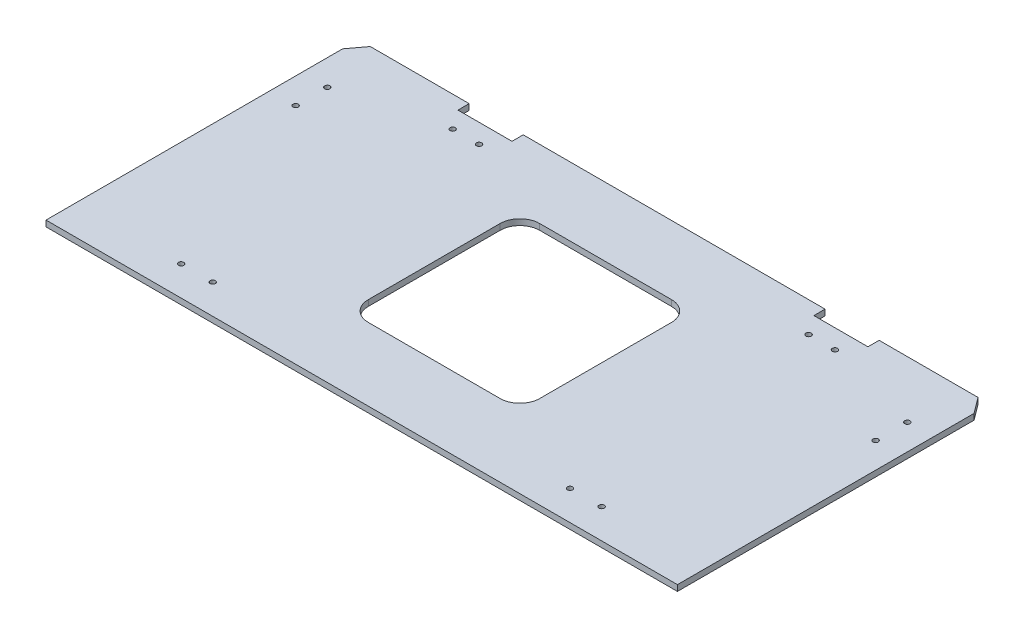
ISO-10303-21;
HEADER;
FILE_DESCRIPTION(('STEP AP214'),'2;1');
FILE_NAME('part.step','',(''),(''),'','','');
FILE_SCHEMA(('AUTOMOTIVE_DESIGN { 1 0 10303 214 1 1 1 1 }'));
ENDSEC;
DATA;
#1=APPLICATION_CONTEXT('core data for automotive mechanical design processes');
#2=APPLICATION_PROTOCOL_DEFINITION('international standard','automotive_design',2000,#1);
#3=PRODUCT_CONTEXT('',#1,'mechanical');
#4=PRODUCT('Part','Part','',(#3));
#5=PRODUCT_RELATED_PRODUCT_CATEGORY('part','',(#4));
#6=PRODUCT_DEFINITION_FORMATION('','',#4);
#7=PRODUCT_DEFINITION_CONTEXT('part definition',#1,'design');
#8=PRODUCT_DEFINITION('design','',#6,#7);
#9=PRODUCT_DEFINITION_SHAPE('','',#8);
#10=(LENGTH_UNIT() NAMED_UNIT(*) SI_UNIT(.MILLI.,.METRE.));
#11=(NAMED_UNIT(*) PLANE_ANGLE_UNIT() SI_UNIT($,.RADIAN.));
#12=(NAMED_UNIT(*) SI_UNIT($,.STERADIAN.) SOLID_ANGLE_UNIT());
#13=UNCERTAINTY_MEASURE_WITH_UNIT(LENGTH_MEASURE(1.E-05),#10,'distance_accuracy_value','');
#14=(GEOMETRIC_REPRESENTATION_CONTEXT(3) GLOBAL_UNCERTAINTY_ASSIGNED_CONTEXT((#13)) GLOBAL_UNIT_ASSIGNED_CONTEXT((#10,
#11,#12)) REPRESENTATION_CONTEXT('',''));
#15=CARTESIAN_POINT('',(0.,0.,0.));
#16=DIRECTION('',(0.,0.,1.));
#17=DIRECTION('',(1.,0.,0.));
#18=AXIS2_PLACEMENT_3D('',#15,#16,#17);
#19=CARTESIAN_POINT('',(0.,4.5,-237.));
#20=DIRECTION('',(0.,0.,1.));
#21=DIRECTION('',(1.,0.,0.));
#22=AXIS2_PLACEMENT_3D('',#19,#20,#21);
#23=PLANE('',#22);
#24=DIRECTION('',(-1.,0.,0.));
#25=VECTOR('',#24,1.);
#26=CARTESIAN_POINT('',(0.,4.5,-237.));
#27=LINE('',#26,#25);
#28=CARTESIAN_POINT('',(354.,4.5,-237.));
#29=VERTEX_POINT('',#28);
#30=CARTESIAN_POINT('',(125.,4.5,-237.));
#31=VERTEX_POINT('',#30);
#32=EDGE_CURVE('E388',#29,#31,#27,.T.);
#33=ORIENTED_EDGE('',*,*,#32,.F.);
#34=DIRECTION('',(0.,1.,0.));
#35=VECTOR('',#34,1.);
#36=CARTESIAN_POINT('',(354.,-0.00100000000000013,-237.));
#37=LINE('',#36,#35);
#38=CARTESIAN_POINT('',(354.,0.,-237.));
#39=VERTEX_POINT('',#38);
#40=EDGE_CURVE('E259',#39,#29,#37,.T.);
#41=ORIENTED_EDGE('',*,*,#40,.F.);
#42=DIRECTION('',(-1.,0.,0.));
#43=VECTOR('',#42,1.);
#44=CARTESIAN_POINT('',(0.,0.,-237.));
#45=LINE('',#44,#43);
#46=CARTESIAN_POINT('',(125.,0.,-237.));
#47=VERTEX_POINT('',#46);
#48=EDGE_CURVE('E399',#39,#47,#45,.T.);
#49=ORIENTED_EDGE('',*,*,#48,.T.);
#50=DIRECTION('',(0.,1.,0.));
#51=VECTOR('',#50,1.);
#52=CARTESIAN_POINT('',(125.,-0.00100000000000013,-237.));
#53=LINE('',#52,#51);
#54=EDGE_CURVE('E295',#47,#31,#53,.T.);
#55=ORIENTED_EDGE('',*,*,#54,.T.);
#56=EDGE_LOOP('',(#33,#41,#49,#55));
#57=FACE_BOUND('',#56,.T.);
#58=ADVANCED_FACE('F35',(#57),#23,.F.);
#59=CARTESIAN_POINT('',(83.9999999999999,0.,-237.));
#60=VERTEX_POINT('',#59);
#61=CARTESIAN_POINT('',(8.99999999999999,0.,-237.));
#62=VERTEX_POINT('',#61);
#63=EDGE_CURVE('E396',#60,#62,#45,.T.);
#64=ORIENTED_EDGE('',*,*,#63,.T.);
#65=DIRECTION('',(0.,1.,0.));
#66=VECTOR('',#65,1.);
#67=CARTESIAN_POINT('',(9.,-0.00100000000000013,-237.));
#68=LINE('',#67,#66);
#69=CARTESIAN_POINT('',(9.,4.5,-237.));
#70=VERTEX_POINT('',#69);
#71=EDGE_CURVE('E240',#62,#70,#68,.T.);
#72=ORIENTED_EDGE('',*,*,#71,.T.);
#73=CARTESIAN_POINT('',(83.9999999999999,4.5,-237.));
#74=VERTEX_POINT('',#73);
#75=EDGE_CURVE('E385',#74,#70,#27,.T.);
#76=ORIENTED_EDGE('',*,*,#75,.F.);
#77=DIRECTION('',(0.,1.,0.));
#78=VECTOR('',#77,1.);
#79=CARTESIAN_POINT('',(83.9999999999999,-0.00100000000000013,-237.));
#80=LINE('',#79,#78);
#81=EDGE_CURVE('E293',#60,#74,#80,.T.);
#82=ORIENTED_EDGE('',*,*,#81,.F.);
#83=EDGE_LOOP('',(#64,#72,#76,#82));
#84=FACE_BOUND('',#83,.T.);
#85=ADVANCED_FACE('F457',(#84),#23,.F.);
#86=CARTESIAN_POINT('',(0.,4.5,0.));
#87=DIRECTION('',(1.,0.,0.));
#88=DIRECTION('',(0.,0.,-1.));
#89=AXIS2_PLACEMENT_3D('',#86,#87,#88);
#90=PLANE('',#89);
#91=DIRECTION('',(0.,0.,1.));
#92=VECTOR('',#91,1.);
#93=CARTESIAN_POINT('',(0.,4.5,0.));
#94=LINE('',#93,#92);
#95=CARTESIAN_POINT('',(0.,4.5,-225.));
#96=VERTEX_POINT('',#95);
#97=CARTESIAN_POINT('',(0.,4.5,0.));
#98=VERTEX_POINT('',#97);
#99=EDGE_CURVE('E377',#96,#98,#94,.T.);
#100=ORIENTED_EDGE('',*,*,#99,.F.);
#101=DIRECTION('',(0.,1.,0.));
#102=VECTOR('',#101,1.);
#103=CARTESIAN_POINT('',(0.,-0.00100000000000013,-225.));
#104=LINE('',#103,#102);
#105=CARTESIAN_POINT('',(0.,0.,-225.));
#106=VERTEX_POINT('',#105);
#107=EDGE_CURVE('E239',#106,#96,#104,.T.);
#108=ORIENTED_EDGE('',*,*,#107,.F.);
#109=DIRECTION('',(0.,0.,1.));
#110=VECTOR('',#109,1.);
#111=CARTESIAN_POINT('',(0.,0.,0.));
#112=LINE('',#111,#110);
#113=CARTESIAN_POINT('',(0.,0.,0.));
#114=VERTEX_POINT('',#113);
#115=EDGE_CURVE('E243',#106,#114,#112,.T.);
#116=ORIENTED_EDGE('',*,*,#115,.T.);
#117=DIRECTION('',(0.,-1.,0.));
#118=VECTOR('',#117,1.);
#119=CARTESIAN_POINT('',(0.,4.5,0.));
#120=LINE('',#119,#118);
#121=EDGE_CURVE('E403',#98,#114,#120,.T.);
#122=ORIENTED_EDGE('',*,*,#121,.F.);
#123=EDGE_LOOP('',(#100,#108,#116,#122));
#124=FACE_BOUND('',#123,.T.);
#125=ADVANCED_FACE('F37',(#124),#90,.F.);
#126=CARTESIAN_POINT('',(0.,4.5,0.));
#127=DIRECTION('',(0.,0.,-1.));
#128=DIRECTION('',(-1.,0.,0.));
#129=AXIS2_PLACEMENT_3D('',#126,#127,#128);
#130=PLANE('',#129);
#131=DIRECTION('',(1.,0.,0.));
#132=VECTOR('',#131,1.);
#133=CARTESIAN_POINT('',(0.,0.,0.));
#134=LINE('',#133,#132);
#135=CARTESIAN_POINT('',(479.,0.,0.));
#136=VERTEX_POINT('',#135);
#137=EDGE_CURVE('E391',#114,#136,#134,.T.);
#138=ORIENTED_EDGE('',*,*,#137,.T.);
#139=DIRECTION('',(0.,-1.,0.));
#140=VECTOR('',#139,1.);
#141=CARTESIAN_POINT('',(479.,4.5,0.));
#142=LINE('',#141,#140);
#143=CARTESIAN_POINT('',(479.,4.5,0.));
#144=VERTEX_POINT('',#143);
#145=EDGE_CURVE('E400',#144,#136,#142,.T.);
#146=ORIENTED_EDGE('',*,*,#145,.F.);
#147=DIRECTION('',(1.,0.,0.));
#148=VECTOR('',#147,1.);
#149=CARTESIAN_POINT('',(0.,4.5,0.));
#150=LINE('',#149,#148);
#151=EDGE_CURVE('E379',#98,#144,#150,.T.);
#152=ORIENTED_EDGE('',*,*,#151,.F.);
#153=ORIENTED_EDGE('',*,*,#121,.T.);
#154=EDGE_LOOP('',(#138,#146,#152,#153));
#155=FACE_BOUND('',#154,.T.);
#156=ADVANCED_FACE('F476',(#155),#130,.F.);
#157=CARTESIAN_POINT('',(479.,4.5,0.));
#158=DIRECTION('',(-1.,0.,0.));
#159=DIRECTION('',(0.,0.,1.));
#160=AXIS2_PLACEMENT_3D('',#157,#158,#159);
#161=PLANE('',#160);
#162=DIRECTION('',(0.,0.,-1.));
#163=VECTOR('',#162,1.);
#164=CARTESIAN_POINT('',(479.,0.,0.));
#165=LINE('',#164,#163);
#166=CARTESIAN_POINT('',(479.,0.,-225.));
#167=VERTEX_POINT('',#166);
#168=EDGE_CURVE('E393',#136,#167,#165,.T.);
#169=ORIENTED_EDGE('',*,*,#168,.T.);
#170=DIRECTION('',(0.,1.,0.));
#171=VECTOR('',#170,1.);
#172=CARTESIAN_POINT('',(479.,-0.00100000000000013,-225.));
#173=LINE('',#172,#171);
#174=CARTESIAN_POINT('',(479.,4.5,-225.));
#175=VERTEX_POINT('',#174);
#176=EDGE_CURVE('E357',#167,#175,#173,.T.);
#177=ORIENTED_EDGE('',*,*,#176,.T.);
#178=DIRECTION('',(0.,0.,-1.));
#179=VECTOR('',#178,1.);
#180=CARTESIAN_POINT('',(479.,4.5,0.));
#181=LINE('',#180,#179);
#182=EDGE_CURVE('E382',#144,#175,#181,.T.);
#183=ORIENTED_EDGE('',*,*,#182,.F.);
#184=ORIENTED_EDGE('',*,*,#145,.T.);
#185=EDGE_LOOP('',(#169,#177,#183,#184));
#186=FACE_BOUND('',#185,.T.);
#187=ADVANCED_FACE('F469',(#186),#161,.F.);
#188=CARTESIAN_POINT('',(470.,0.,-237.));
#189=VERTEX_POINT('',#188);
#190=CARTESIAN_POINT('',(395.,0.,-237.));
#191=VERTEX_POINT('',#190);
#192=EDGE_CURVE('E380',#189,#191,#45,.T.);
#193=ORIENTED_EDGE('',*,*,#192,.T.);
#194=DIRECTION('',(0.,1.,0.));
#195=VECTOR('',#194,1.);
#196=CARTESIAN_POINT('',(395.,-0.00100000000000013,-237.));
#197=LINE('',#196,#195);
#198=CARTESIAN_POINT('',(395.,4.5,-237.));
#199=VERTEX_POINT('',#198);
#200=EDGE_CURVE('E262',#191,#199,#197,.T.);
#201=ORIENTED_EDGE('',*,*,#200,.T.);
#202=CARTESIAN_POINT('',(470.,4.5,-237.));
#203=VERTEX_POINT('',#202);
#204=EDGE_CURVE('E389',#203,#199,#27,.T.);
#205=ORIENTED_EDGE('',*,*,#204,.F.);
#206=DIRECTION('',(0.,1.,0.));
#207=VECTOR('',#206,1.);
#208=CARTESIAN_POINT('',(470.,-0.00100000000000013,-237.));
#209=LINE('',#208,#207);
#210=EDGE_CURVE('E237',#189,#203,#209,.T.);
#211=ORIENTED_EDGE('',*,*,#210,.F.);
#212=EDGE_LOOP('',(#193,#201,#205,#211));
#213=FACE_BOUND('',#212,.T.);
#214=ADVANCED_FACE('F460',(#213),#23,.F.);
#215=CARTESIAN_POINT('',(0.,4.5,0.));
#216=DIRECTION('',(0.,-1.,0.));
#217=DIRECTION('',(0.,0.,-1.));
#218=AXIS2_PLACEMENT_3D('',#215,#216,#217);
#219=PLANE('',#218);
#220=DIRECTION('',(1.,0.,0.));
#221=VECTOR('',#220,1.);
#222=CARTESIAN_POINT('',(289.5,4.5,-55.));
#223=LINE('',#222,#221);
#224=CARTESIAN_POINT('',(189.5,4.5,-55.));
#225=VERTEX_POINT('',#224);
#226=CARTESIAN_POINT('',(289.5,4.5,-55.));
#227=VERTEX_POINT('',#226);
#228=EDGE_CURVE('E195',#225,#227,#223,.T.);
#229=ORIENTED_EDGE('',*,*,#228,.F.);
#230=CARTESIAN_POINT('',(189.5,4.5,-70.));
#231=DIRECTION('',(0.,1.,0.));
#232=DIRECTION('',(0.,0.,-1.));
#233=AXIS2_PLACEMENT_3D('',#230,#231,#232);
#234=CIRCLE('',#233,15.);
#235=CARTESIAN_POINT('',(174.5,4.5,-70.));
#236=VERTEX_POINT('',#235);
#237=EDGE_CURVE('E50',#236,#225,#234,.T.);
#238=ORIENTED_EDGE('',*,*,#237,.F.);
#239=DIRECTION('',(0.,0.,1.));
#240=VECTOR('',#239,1.);
#241=CARTESIAN_POINT('',(174.5,4.5,-70.));
#242=LINE('',#241,#240);
#243=CARTESIAN_POINT('',(174.5,4.5,-170.));
#244=VERTEX_POINT('',#243);
#245=EDGE_CURVE('E217',#244,#236,#242,.T.);
#246=ORIENTED_EDGE('',*,*,#245,.F.);
#247=CARTESIAN_POINT('',(189.5,4.5,-170.));
#248=DIRECTION('',(0.,1.,0.));
#249=DIRECTION('',(0.,0.,1.));
#250=AXIS2_PLACEMENT_3D('',#247,#248,#249);
#251=CIRCLE('',#250,15.);
#252=CARTESIAN_POINT('',(189.5,4.5,-185.));
#253=VERTEX_POINT('',#252);
#254=EDGE_CURVE('E214',#253,#244,#251,.T.);
#255=ORIENTED_EDGE('',*,*,#254,.F.);
#256=DIRECTION('',(-1.,0.,0.));
#257=VECTOR('',#256,1.);
#258=CARTESIAN_POINT('',(289.5,4.5,-185.));
#259=LINE('',#258,#257);
#260=CARTESIAN_POINT('',(289.5,4.5,-185.));
#261=VERTEX_POINT('',#260);
#262=EDGE_CURVE('E211',#261,#253,#259,.T.);
#263=ORIENTED_EDGE('',*,*,#262,.F.);
#264=CARTESIAN_POINT('',(289.5,4.5,-170.));
#265=DIRECTION('',(0.,1.,0.));
#266=DIRECTION('',(0.,0.,1.));
#267=AXIS2_PLACEMENT_3D('',#264,#265,#266);
#268=CIRCLE('',#267,15.);
#269=CARTESIAN_POINT('',(304.5,4.5,-170.));
#270=VERTEX_POINT('',#269);
#271=EDGE_CURVE('E205',#270,#261,#268,.T.);
#272=ORIENTED_EDGE('',*,*,#271,.F.);
#273=DIRECTION('',(0.,0.,-1.));
#274=VECTOR('',#273,1.);
#275=CARTESIAN_POINT('',(304.5,4.5,-70.));
#276=LINE('',#275,#274);
#277=CARTESIAN_POINT('',(304.5,4.5,-70.));
#278=VERTEX_POINT('',#277);
#279=EDGE_CURVE('E203',#278,#270,#276,.T.);
#280=ORIENTED_EDGE('',*,*,#279,.F.);
#281=CARTESIAN_POINT('',(289.5,4.5,-70.));
#282=DIRECTION('',(0.,1.,0.));
#283=DIRECTION('',(0.,0.,1.));
#284=AXIS2_PLACEMENT_3D('',#281,#282,#283);
#285=CIRCLE('',#284,15.);
#286=EDGE_CURVE('E186',#227,#278,#285,.T.);
#287=ORIENTED_EDGE('',*,*,#286,.F.);
#288=EDGE_LOOP('',(#229,#238,#246,#255,#263,#272,#280,#287));
#289=FACE_BOUND('',#288,.T.);
#290=CARTESIAN_POINT('',(19.5,4.5,-193.9));
#291=DIRECTION('',(0.,1.,0.));
#292=DIRECTION('',(0.,0.,-1.));
#293=AXIS2_PLACEMENT_3D('',#290,#291,#292);
#294=CIRCLE('',#293,2.);
#295=CARTESIAN_POINT('',(19.5,4.5,-195.9));
#296=VERTEX_POINT('',#295);
#297=EDGE_CURVE('E303',#296,#296,#294,.T.);
#298=ORIENTED_EDGE('',*,*,#297,.F.);
#299=EDGE_LOOP('',(#298));
#300=FACE_BOUND('',#299,.T.);
#301=CARTESIAN_POINT('',(94.5,4.5,-214.));
#302=DIRECTION('',(0.,1.,0.));
#303=DIRECTION('',(0.,0.,1.));
#304=AXIS2_PLACEMENT_3D('',#301,#302,#303);
#305=CIRCLE('',#304,2.);
#306=CARTESIAN_POINT('',(94.5,4.5,-212.));
#307=VERTEX_POINT('',#306);
#308=EDGE_CURVE('E310',#307,#307,#305,.T.);
#309=ORIENTED_EDGE('',*,*,#308,.F.);
#310=EDGE_LOOP('',(#309));
#311=FACE_BOUND('',#310,.T.);
#312=CARTESIAN_POINT('',(114.5,4.5,-214.));
#313=DIRECTION('',(0.,1.,0.));
#314=DIRECTION('',(0.,0.,1.));
#315=AXIS2_PLACEMENT_3D('',#312,#313,#314);
#316=CIRCLE('',#315,2.);
#317=CARTESIAN_POINT('',(114.5,4.5,-212.));
#318=VERTEX_POINT('',#317);
#319=EDGE_CURVE('E316',#318,#318,#316,.T.);
#320=ORIENTED_EDGE('',*,*,#319,.F.);
#321=EDGE_LOOP('',(#320));
#322=FACE_BOUND('',#321,.T.);
#323=CARTESIAN_POINT('',(364.5,4.5,-214.));
#324=DIRECTION('',(0.,1.,0.));
#325=DIRECTION('',(0.,0.,-1.));
#326=AXIS2_PLACEMENT_3D('',#323,#324,#325);
#327=CIRCLE('',#326,2.);
#328=CARTESIAN_POINT('',(364.5,4.5,-216.));
#329=VERTEX_POINT('',#328);
#330=EDGE_CURVE('E322',#329,#329,#327,.T.);
#331=ORIENTED_EDGE('',*,*,#330,.F.);
#332=EDGE_LOOP('',(#331));
#333=FACE_BOUND('',#332,.T.);
#334=CARTESIAN_POINT('',(384.5,4.5,-214.));
#335=DIRECTION('',(0.,1.,0.));
#336=DIRECTION('',(0.,0.,-1.));
#337=AXIS2_PLACEMENT_3D('',#334,#335,#336);
#338=CIRCLE('',#337,2.);
#339=CARTESIAN_POINT('',(384.5,4.5,-216.));
#340=VERTEX_POINT('',#339);
#341=EDGE_CURVE('E271',#340,#340,#338,.T.);
#342=ORIENTED_EDGE('',*,*,#341,.F.);
#343=EDGE_LOOP('',(#342));
#344=FACE_BOUND('',#343,.T.);
#345=CARTESIAN_POINT('',(399.,4.5,-22.5));
#346=DIRECTION('',(0.,1.,0.));
#347=DIRECTION('',(0.,0.,1.));
#348=AXIS2_PLACEMENT_3D('',#345,#346,#347);
#349=CIRCLE('',#348,2.);
#350=CARTESIAN_POINT('',(399.,4.5,-20.5));
#351=VERTEX_POINT('',#350);
#352=EDGE_CURVE('E355',#351,#351,#349,.T.);
#353=ORIENTED_EDGE('',*,*,#352,.F.);
#354=EDGE_LOOP('',(#353));
#355=FACE_BOUND('',#354,.T.);
#356=CARTESIAN_POINT('',(375.,4.5,-22.5));
#357=DIRECTION('',(0.,1.,0.));
#358=DIRECTION('',(0.,0.,1.));
#359=AXIS2_PLACEMENT_3D('',#356,#357,#358);
#360=CIRCLE('',#359,2.);
#361=CARTESIAN_POINT('',(375.,4.5,-20.5));
#362=VERTEX_POINT('',#361);
#363=EDGE_CURVE('E366',#362,#362,#360,.T.);
#364=ORIENTED_EDGE('',*,*,#363,.F.);
#365=EDGE_LOOP('',(#364));
#366=FACE_BOUND('',#365,.T.);
#367=CARTESIAN_POINT('',(104.,4.5,-22.5000000000001));
#368=DIRECTION('',(0.,1.,0.));
#369=DIRECTION('',(0.,0.,-1.));
#370=AXIS2_PLACEMENT_3D('',#367,#368,#369);
#371=CIRCLE('',#370,2.);
#372=CARTESIAN_POINT('',(104.,4.5,-24.5));
#373=VERTEX_POINT('',#372);
#374=EDGE_CURVE('E372',#373,#373,#371,.T.);
#375=ORIENTED_EDGE('',*,*,#374,.F.);
#376=EDGE_LOOP('',(#375));
#377=FACE_BOUND('',#376,.T.);
#378=CARTESIAN_POINT('',(19.5,4.5,-169.9));
#379=DIRECTION('',(0.,1.,0.));
#380=DIRECTION('',(0.,0.,-1.));
#381=AXIS2_PLACEMENT_3D('',#378,#379,#380);
#382=CIRCLE('',#381,2.);
#383=CARTESIAN_POINT('',(19.5,4.5,-171.9));
#384=VERTEX_POINT('',#383);
#385=EDGE_CURVE('E334',#384,#384,#382,.T.);
#386=ORIENTED_EDGE('',*,*,#385,.F.);
#387=EDGE_LOOP('',(#386));
#388=FACE_BOUND('',#387,.T.);
#389=CARTESIAN_POINT('',(459.5,4.5,-169.9));
#390=DIRECTION('',(0.,1.,0.));
#391=DIRECTION('',(0.,0.,1.));
#392=AXIS2_PLACEMENT_3D('',#389,#390,#391);
#393=CIRCLE('',#392,2.);
#394=CARTESIAN_POINT('',(459.5,4.5,-167.9));
#395=VERTEX_POINT('',#394);
#396=EDGE_CURVE('E327',#395,#395,#393,.T.);
#397=ORIENTED_EDGE('',*,*,#396,.F.);
#398=EDGE_LOOP('',(#397));
#399=FACE_BOUND('',#398,.T.);
#400=CARTESIAN_POINT('',(459.5,4.5,-193.9));
#401=DIRECTION('',(0.,1.,0.));
#402=DIRECTION('',(0.,0.,1.));
#403=AXIS2_PLACEMENT_3D('',#400,#401,#402);
#404=CIRCLE('',#403,2.);
#405=CARTESIAN_POINT('',(459.5,4.5,-191.9));
#406=VERTEX_POINT('',#405);
#407=EDGE_CURVE('E346',#406,#406,#404,.T.);
#408=ORIENTED_EDGE('',*,*,#407,.F.);
#409=EDGE_LOOP('',(#408));
#410=FACE_BOUND('',#409,.T.);
#411=CARTESIAN_POINT('',(80.0000000000001,4.5,-22.5000000000001));
#412=DIRECTION('',(0.,1.,0.));
#413=DIRECTION('',(0.,0.,-1.));
#414=AXIS2_PLACEMENT_3D('',#411,#412,#413);
#415=CIRCLE('',#414,2.);
#416=CARTESIAN_POINT('',(80.0000000000001,4.5,-24.5));
#417=VERTEX_POINT('',#416);
#418=EDGE_CURVE('E339',#417,#417,#415,.T.);
#419=ORIENTED_EDGE('',*,*,#418,.F.);
#420=EDGE_LOOP('',(#419));
#421=FACE_BOUND('',#420,.T.);
#422=ORIENTED_EDGE('',*,*,#75,.T.);
#423=DIRECTION('',(0.6,0.,-0.8));
#424=VECTOR('',#423,1.);
#425=CARTESIAN_POINT('',(0.,4.5,-225.));
#426=LINE('',#425,#424);
#427=EDGE_CURVE('E236',#96,#70,#426,.T.);
#428=ORIENTED_EDGE('',*,*,#427,.F.);
#429=ORIENTED_EDGE('',*,*,#99,.T.);
#430=ORIENTED_EDGE('',*,*,#151,.T.);
#431=ORIENTED_EDGE('',*,*,#182,.T.);
#432=DIRECTION('',(0.6,0.,0.8));
#433=VECTOR('',#432,1.);
#434=CARTESIAN_POINT('',(479.,4.5,-225.));
#435=LINE('',#434,#433);
#436=EDGE_CURVE('E354',#203,#175,#435,.T.);
#437=ORIENTED_EDGE('',*,*,#436,.F.);
#438=ORIENTED_EDGE('',*,*,#204,.T.);
#439=DIRECTION('',(0.,0.,-1.));
#440=VECTOR('',#439,1.);
#441=CARTESIAN_POINT('',(395.,4.5,-228.5));
#442=LINE('',#441,#440);
#443=CARTESIAN_POINT('',(395.,4.5,-228.5));
#444=VERTEX_POINT('',#443);
#445=EDGE_CURVE('E256',#444,#199,#442,.T.);
#446=ORIENTED_EDGE('',*,*,#445,.F.);
#447=DIRECTION('',(1.,0.,0.));
#448=VECTOR('',#447,1.);
#449=CARTESIAN_POINT('',(354.,4.5,-228.5));
#450=LINE('',#449,#448);
#451=CARTESIAN_POINT('',(354.,4.5,-228.5));
#452=VERTEX_POINT('',#451);
#453=EDGE_CURVE('E253',#452,#444,#450,.T.);
#454=ORIENTED_EDGE('',*,*,#453,.F.);
#455=DIRECTION('',(0.,0.,1.));
#456=VECTOR('',#455,1.);
#457=CARTESIAN_POINT('',(354.,4.5,-228.5));
#458=LINE('',#457,#456);
#459=EDGE_CURVE('E250',#29,#452,#458,.T.);
#460=ORIENTED_EDGE('',*,*,#459,.F.);
#461=ORIENTED_EDGE('',*,*,#32,.T.);
#462=DIRECTION('',(0.,0.,-1.));
#463=VECTOR('',#462,1.);
#464=CARTESIAN_POINT('',(125.,4.5,-228.5));
#465=LINE('',#464,#463);
#466=CARTESIAN_POINT('',(125.,4.5,-228.5));
#467=VERTEX_POINT('',#466);
#468=EDGE_CURVE('E290',#467,#31,#465,.T.);
#469=ORIENTED_EDGE('',*,*,#468,.F.);
#470=DIRECTION('',(1.,0.,0.));
#471=VECTOR('',#470,1.);
#472=CARTESIAN_POINT('',(125.,4.5,-228.5));
#473=LINE('',#472,#471);
#474=CARTESIAN_POINT('',(83.9999999999999,4.5,-228.5));
#475=VERTEX_POINT('',#474);
#476=EDGE_CURVE('E287',#475,#467,#473,.T.);
#477=ORIENTED_EDGE('',*,*,#476,.F.);
#478=DIRECTION('',(0.,0.,1.));
#479=VECTOR('',#478,1.);
#480=CARTESIAN_POINT('',(83.9999999999999,4.5,-228.5));
#481=LINE('',#480,#479);
#482=EDGE_CURVE('E284',#74,#475,#481,.T.);
#483=ORIENTED_EDGE('',*,*,#482,.F.);
#484=EDGE_LOOP('',(#422,#428,#429,#430,#431,#437,#438,#446,#454,#460,#461,#469,#477,#483));
#485=FACE_BOUND('',#484,.T.);
#486=ADVANCED_FACE('F199',(#289,#300,#311,#322,#333,#344,#355,#366,#377,#388,#399,#410,#421,
#485),#219,.F.);
#487=CARTESIAN_POINT('',(0.,0.,0.));
#488=DIRECTION('',(0.,-1.,0.));
#489=DIRECTION('',(0.,0.,-1.));
#490=AXIS2_PLACEMENT_3D('',#487,#488,#489);
#491=PLANE('',#490);
#492=CARTESIAN_POINT('',(189.5,0.,-70.));
#493=DIRECTION('',(0.,-1.,0.));
#494=DIRECTION('',(0.,0.,-1.));
#495=AXIS2_PLACEMENT_3D('',#492,#493,#494);
#496=CIRCLE('',#495,15.);
#497=CARTESIAN_POINT('',(189.5,0.,-55.));
#498=VERTEX_POINT('',#497);
#499=CARTESIAN_POINT('',(174.5,0.,-70.));
#500=VERTEX_POINT('',#499);
#501=EDGE_CURVE('E11',#498,#500,#496,.T.);
#502=ORIENTED_EDGE('',*,*,#501,.F.);
#503=DIRECTION('',(-1.,0.,0.));
#504=VECTOR('',#503,1.);
#505=CARTESIAN_POINT('',(0.,0.,-55.));
#506=LINE('',#505,#504);
#507=CARTESIAN_POINT('',(289.5,0.,-55.));
#508=VERTEX_POINT('',#507);
#509=EDGE_CURVE('E406',#508,#498,#506,.T.);
#510=ORIENTED_EDGE('',*,*,#509,.F.);
#511=CARTESIAN_POINT('',(289.5,0.,-70.));
#512=DIRECTION('',(0.,-1.,0.));
#513=DIRECTION('',(0.,0.,-1.));
#514=AXIS2_PLACEMENT_3D('',#511,#512,#513);
#515=CIRCLE('',#514,15.);
#516=CARTESIAN_POINT('',(304.5,0.,-70.));
#517=VERTEX_POINT('',#516);
#518=EDGE_CURVE('E189',#517,#508,#515,.T.);
#519=ORIENTED_EDGE('',*,*,#518,.F.);
#520=DIRECTION('',(0.,0.,1.));
#521=VECTOR('',#520,1.);
#522=CARTESIAN_POINT('',(304.5,0.,0.));
#523=LINE('',#522,#521);
#524=CARTESIAN_POINT('',(304.5,0.,-170.));
#525=VERTEX_POINT('',#524);
#526=EDGE_CURVE('E409',#525,#517,#523,.T.);
#527=ORIENTED_EDGE('',*,*,#526,.F.);
#528=CARTESIAN_POINT('',(289.5,0.,-170.));
#529=DIRECTION('',(0.,-1.,0.));
#530=DIRECTION('',(0.,0.,-1.));
#531=AXIS2_PLACEMENT_3D('',#528,#529,#530);
#532=CIRCLE('',#531,15.);
#533=CARTESIAN_POINT('',(289.5,0.,-185.));
#534=VERTEX_POINT('',#533);
#535=EDGE_CURVE('E411',#534,#525,#532,.T.);
#536=ORIENTED_EDGE('',*,*,#535,.F.);
#537=DIRECTION('',(1.,0.,0.));
#538=VECTOR('',#537,1.);
#539=CARTESIAN_POINT('',(0.,0.,-185.));
#540=LINE('',#539,#538);
#541=CARTESIAN_POINT('',(189.5,0.,-185.));
#542=VERTEX_POINT('',#541);
#543=EDGE_CURVE('E413',#542,#534,#540,.T.);
#544=ORIENTED_EDGE('',*,*,#543,.F.);
#545=CARTESIAN_POINT('',(189.5,0.,-170.));
#546=DIRECTION('',(0.,-1.,0.));
#547=DIRECTION('',(0.,0.,-1.));
#548=AXIS2_PLACEMENT_3D('',#545,#546,#547);
#549=CIRCLE('',#548,15.);
#550=CARTESIAN_POINT('',(174.5,0.,-170.));
#551=VERTEX_POINT('',#550);
#552=EDGE_CURVE('E415',#551,#542,#549,.T.);
#553=ORIENTED_EDGE('',*,*,#552,.F.);
#554=DIRECTION('',(0.,0.,-1.));
#555=VECTOR('',#554,1.);
#556=CARTESIAN_POINT('',(174.5,0.,0.));
#557=LINE('',#556,#555);
#558=EDGE_CURVE('E43',#500,#551,#557,.T.);
#559=ORIENTED_EDGE('',*,*,#558,.F.);
#560=EDGE_LOOP('',(#502,#510,#519,#527,#536,#544,#553,#559));
#561=FACE_BOUND('',#560,.T.);
#562=DIRECTION('',(0.6,0.,-0.8));
#563=VECTOR('',#562,1.);
#564=CARTESIAN_POINT('',(0.,0.,-225.));
#565=LINE('',#564,#563);
#566=EDGE_CURVE('E233',#106,#62,#565,.T.);
#567=ORIENTED_EDGE('',*,*,#566,.T.);
#568=ORIENTED_EDGE('',*,*,#63,.F.);
#569=DIRECTION('',(0.,0.,1.));
#570=VECTOR('',#569,1.);
#571=CARTESIAN_POINT('',(83.9999999999999,0.,-228.5));
#572=LINE('',#571,#570);
#573=CARTESIAN_POINT('',(83.9999999999999,0.,-228.5));
#574=VERTEX_POINT('',#573);
#575=EDGE_CURVE('E281',#60,#574,#572,.T.);
#576=ORIENTED_EDGE('',*,*,#575,.T.);
#577=DIRECTION('',(1.,0.,0.));
#578=VECTOR('',#577,1.);
#579=CARTESIAN_POINT('',(125.,0.,-228.5));
#580=LINE('',#579,#578);
#581=CARTESIAN_POINT('',(125.,0.,-228.5));
#582=VERTEX_POINT('',#581);
#583=EDGE_CURVE('E278',#574,#582,#580,.T.);
#584=ORIENTED_EDGE('',*,*,#583,.T.);
#585=DIRECTION('',(0.,0.,-1.));
#586=VECTOR('',#585,1.);
#587=CARTESIAN_POINT('',(125.,0.,-228.5));
#588=LINE('',#587,#586);
#589=EDGE_CURVE('E270',#582,#47,#588,.T.);
#590=ORIENTED_EDGE('',*,*,#589,.T.);
#591=ORIENTED_EDGE('',*,*,#48,.F.);
#592=DIRECTION('',(0.,0.,1.));
#593=VECTOR('',#592,1.);
#594=CARTESIAN_POINT('',(354.,0.,-228.5));
#595=LINE('',#594,#593);
#596=CARTESIAN_POINT('',(354.,0.,-228.5));
#597=VERTEX_POINT('',#596);
#598=EDGE_CURVE('E247',#39,#597,#595,.T.);
#599=ORIENTED_EDGE('',*,*,#598,.T.);
#600=DIRECTION('',(1.,0.,0.));
#601=VECTOR('',#600,1.);
#602=CARTESIAN_POINT('',(354.,0.,-228.5));
#603=LINE('',#602,#601);
#604=CARTESIAN_POINT('',(395.,0.,-228.5));
#605=VERTEX_POINT('',#604);
#606=EDGE_CURVE('E261',#597,#605,#603,.T.);
#607=ORIENTED_EDGE('',*,*,#606,.T.);
#608=DIRECTION('',(0.,0.,-1.));
#609=VECTOR('',#608,1.);
#610=CARTESIAN_POINT('',(395.,0.,-228.5));
#611=LINE('',#610,#609);
#612=EDGE_CURVE('E222',#605,#191,#611,.T.);
#613=ORIENTED_EDGE('',*,*,#612,.T.);
#614=ORIENTED_EDGE('',*,*,#192,.F.);
#615=DIRECTION('',(0.6,0.,0.8));
#616=VECTOR('',#615,1.);
#617=CARTESIAN_POINT('',(479.,0.,-225.));
#618=LINE('',#617,#616);
#619=EDGE_CURVE('E351',#189,#167,#618,.T.);
#620=ORIENTED_EDGE('',*,*,#619,.T.);
#621=ORIENTED_EDGE('',*,*,#168,.F.);
#622=ORIENTED_EDGE('',*,*,#137,.F.);
#623=ORIENTED_EDGE('',*,*,#115,.F.);
#624=EDGE_LOOP('',(#567,#568,#576,#584,#590,#591,#599,#607,#613,#614,#620,#621,#622,#623));
#625=FACE_BOUND('',#624,.T.);
#626=CARTESIAN_POINT('',(19.5,0.,-193.9));
#627=DIRECTION('',(0.,-1.,0.));
#628=DIRECTION('',(0.,0.,-1.));
#629=AXIS2_PLACEMENT_3D('',#626,#627,#628);
#630=CIRCLE('',#629,2.);
#631=CARTESIAN_POINT('',(19.5,0.,-195.9));
#632=VERTEX_POINT('',#631);
#633=EDGE_CURVE('E307',#632,#632,#630,.F.);
#634=ORIENTED_EDGE('',*,*,#633,.T.);
#635=EDGE_LOOP('',(#634));
#636=FACE_BOUND('',#635,.T.);
#637=CARTESIAN_POINT('',(94.5,0.,-214.));
#638=DIRECTION('',(0.,-1.,0.));
#639=DIRECTION('',(0.,0.,-1.));
#640=AXIS2_PLACEMENT_3D('',#637,#638,#639);
#641=CIRCLE('',#640,2.);
#642=CARTESIAN_POINT('',(94.5,0.,-216.));
#643=VERTEX_POINT('',#642);
#644=EDGE_CURVE('E313',#643,#643,#641,.F.);
#645=ORIENTED_EDGE('',*,*,#644,.T.);
#646=EDGE_LOOP('',(#645));
#647=FACE_BOUND('',#646,.T.);
#648=CARTESIAN_POINT('',(114.5,0.,-214.));
#649=DIRECTION('',(0.,-1.,0.));
#650=DIRECTION('',(0.,0.,-1.));
#651=AXIS2_PLACEMENT_3D('',#648,#649,#650);
#652=CIRCLE('',#651,2.);
#653=CARTESIAN_POINT('',(114.5,0.,-216.));
#654=VERTEX_POINT('',#653);
#655=EDGE_CURVE('E319',#654,#654,#652,.F.);
#656=ORIENTED_EDGE('',*,*,#655,.T.);
#657=EDGE_LOOP('',(#656));
#658=FACE_BOUND('',#657,.T.);
#659=CARTESIAN_POINT('',(364.5,0.,-214.));
#660=DIRECTION('',(0.,-1.,0.));
#661=DIRECTION('',(0.,0.,-1.));
#662=AXIS2_PLACEMENT_3D('',#659,#660,#661);
#663=CIRCLE('',#662,2.);
#664=CARTESIAN_POINT('',(364.5,0.,-216.));
#665=VERTEX_POINT('',#664);
#666=EDGE_CURVE('E274',#665,#665,#663,.F.);
#667=ORIENTED_EDGE('',*,*,#666,.T.);
#668=EDGE_LOOP('',(#667));
#669=FACE_BOUND('',#668,.T.);
#670=CARTESIAN_POINT('',(384.5,0.,-214.));
#671=DIRECTION('',(0.,-1.,0.));
#672=DIRECTION('',(0.,0.,-1.));
#673=AXIS2_PLACEMENT_3D('',#670,#671,#672);
#674=CIRCLE('',#673,2.);
#675=CARTESIAN_POINT('',(384.5,0.,-216.));
#676=VERTEX_POINT('',#675);
#677=EDGE_CURVE('E275',#676,#676,#674,.F.);
#678=ORIENTED_EDGE('',*,*,#677,.T.);
#679=EDGE_LOOP('',(#678));
#680=FACE_BOUND('',#679,.T.);
#681=CARTESIAN_POINT('',(399.,0.,-22.5));
#682=DIRECTION('',(0.,-1.,0.));
#683=DIRECTION('',(0.,0.,-1.));
#684=AXIS2_PLACEMENT_3D('',#681,#682,#683);
#685=CIRCLE('',#684,2.);
#686=CARTESIAN_POINT('',(399.,0.,-24.5));
#687=VERTEX_POINT('',#686);
#688=EDGE_CURVE('E363',#687,#687,#685,.F.);
#689=ORIENTED_EDGE('',*,*,#688,.T.);
#690=EDGE_LOOP('',(#689));
#691=FACE_BOUND('',#690,.T.);
#692=CARTESIAN_POINT('',(375.,0.,-22.5));
#693=DIRECTION('',(0.,-1.,0.));
#694=DIRECTION('',(0.,0.,-1.));
#695=AXIS2_PLACEMENT_3D('',#692,#693,#694);
#696=CIRCLE('',#695,2.);
#697=CARTESIAN_POINT('',(375.,0.,-24.5));
#698=VERTEX_POINT('',#697);
#699=EDGE_CURVE('E369',#698,#698,#696,.F.);
#700=ORIENTED_EDGE('',*,*,#699,.T.);
#701=EDGE_LOOP('',(#700));
#702=FACE_BOUND('',#701,.T.);
#703=CARTESIAN_POINT('',(104.,0.,-22.5000000000001));
#704=DIRECTION('',(0.,-1.,0.));
#705=DIRECTION('',(0.,0.,-1.));
#706=AXIS2_PLACEMENT_3D('',#703,#704,#705);
#707=CIRCLE('',#706,2.);
#708=CARTESIAN_POINT('',(104.,0.,-24.5));
#709=VERTEX_POINT('',#708);
#710=EDGE_CURVE('E342',#709,#709,#707,.F.);
#711=ORIENTED_EDGE('',*,*,#710,.T.);
#712=EDGE_LOOP('',(#711));
#713=FACE_BOUND('',#712,.T.);
#714=CARTESIAN_POINT('',(19.5,0.,-169.9));
#715=DIRECTION('',(0.,-1.,0.));
#716=DIRECTION('',(0.,0.,-1.));
#717=AXIS2_PLACEMENT_3D('',#714,#715,#716);
#718=CIRCLE('',#717,2.);
#719=CARTESIAN_POINT('',(19.5,0.,-171.9));
#720=VERTEX_POINT('',#719);
#721=EDGE_CURVE('E306',#720,#720,#718,.F.);
#722=ORIENTED_EDGE('',*,*,#721,.T.);
#723=EDGE_LOOP('',(#722));
#724=FACE_BOUND('',#723,.T.);
#725=CARTESIAN_POINT('',(459.5,0.,-169.9));
#726=DIRECTION('',(0.,-1.,0.));
#727=DIRECTION('',(0.,0.,-1.));
#728=AXIS2_PLACEMENT_3D('',#725,#726,#727);
#729=CIRCLE('',#728,2.);
#730=CARTESIAN_POINT('',(459.5,0.,-171.9));
#731=VERTEX_POINT('',#730);
#732=EDGE_CURVE('E331',#731,#731,#729,.F.);
#733=ORIENTED_EDGE('',*,*,#732,.T.);
#734=EDGE_LOOP('',(#733));
#735=FACE_BOUND('',#734,.T.);
#736=CARTESIAN_POINT('',(459.5,0.,-193.9));
#737=DIRECTION('',(0.,-1.,0.));
#738=DIRECTION('',(0.,0.,-1.));
#739=AXIS2_PLACEMENT_3D('',#736,#737,#738);
#740=CIRCLE('',#739,2.);
#741=CARTESIAN_POINT('',(459.5,0.,-195.9));
#742=VERTEX_POINT('',#741);
#743=EDGE_CURVE('E330',#742,#742,#740,.F.);
#744=ORIENTED_EDGE('',*,*,#743,.T.);
#745=EDGE_LOOP('',(#744));
#746=FACE_BOUND('',#745,.T.);
#747=CARTESIAN_POINT('',(80.0000000000001,0.,-22.5000000000001));
#748=DIRECTION('',(0.,-1.,0.));
#749=DIRECTION('',(0.,0.,-1.));
#750=AXIS2_PLACEMENT_3D('',#747,#748,#749);
#751=CIRCLE('',#750,2.);
#752=CARTESIAN_POINT('',(80.0000000000001,0.,-24.5));
#753=VERTEX_POINT('',#752);
#754=EDGE_CURVE('E343',#753,#753,#751,.F.);
#755=ORIENTED_EDGE('',*,*,#754,.T.);
#756=EDGE_LOOP('',(#755));
#757=FACE_BOUND('',#756,.T.);
#758=ADVANCED_FACE('F430',(#561,#625,#636,#647,#658,#669,#680,#691,#702,#713,#724,#735,#746,
#757),#491,.T.);
#759=CARTESIAN_POINT('',(80.0000000000001,-0.00100000000000013,-22.5000000000001));
#760=DIRECTION('',(0.,1.,0.));
#761=DIRECTION('',(0.,0.,1.));
#762=AXIS2_PLACEMENT_3D('',#759,#760,#761);
#763=CYLINDRICAL_SURFACE('',#762,2.);
#764=ORIENTED_EDGE('',*,*,#754,.F.);
#765=EDGE_LOOP('',(#764));
#766=FACE_BOUND('',#765,.T.);
#767=ORIENTED_EDGE('',*,*,#418,.T.);
#768=EDGE_LOOP('',(#767));
#769=FACE_BOUND('',#768,.T.);
#770=ADVANCED_FACE('F563',(#766,#769),#763,.F.);
#771=CARTESIAN_POINT('',(459.5,-0.00100000000000013,-193.9));
#772=DIRECTION('',(0.,1.,0.));
#773=DIRECTION('',(0.,0.,1.));
#774=AXIS2_PLACEMENT_3D('',#771,#772,#773);
#775=CYLINDRICAL_SURFACE('',#774,2.);
#776=ORIENTED_EDGE('',*,*,#743,.F.);
#777=EDGE_LOOP('',(#776));
#778=FACE_BOUND('',#777,.T.);
#779=ORIENTED_EDGE('',*,*,#407,.T.);
#780=EDGE_LOOP('',(#779));
#781=FACE_BOUND('',#780,.T.);
#782=ADVANCED_FACE('F557',(#778,#781),#775,.F.);
#783=CARTESIAN_POINT('',(459.5,-0.00100000000000013,-169.9));
#784=DIRECTION('',(0.,1.,0.));
#785=DIRECTION('',(0.,0.,1.));
#786=AXIS2_PLACEMENT_3D('',#783,#784,#785);
#787=CYLINDRICAL_SURFACE('',#786,2.);
#788=ORIENTED_EDGE('',*,*,#732,.F.);
#789=EDGE_LOOP('',(#788));
#790=FACE_BOUND('',#789,.T.);
#791=ORIENTED_EDGE('',*,*,#396,.T.);
#792=EDGE_LOOP('',(#791));
#793=FACE_BOUND('',#792,.T.);
#794=ADVANCED_FACE('F553',(#790,#793),#787,.F.);
#795=CARTESIAN_POINT('',(19.5,-0.00100000000000013,-169.9));
#796=DIRECTION('',(0.,1.,0.));
#797=DIRECTION('',(0.,0.,1.));
#798=AXIS2_PLACEMENT_3D('',#795,#796,#797);
#799=CYLINDRICAL_SURFACE('',#798,2.);
#800=ORIENTED_EDGE('',*,*,#721,.F.);
#801=EDGE_LOOP('',(#800));
#802=FACE_BOUND('',#801,.T.);
#803=ORIENTED_EDGE('',*,*,#385,.T.);
#804=EDGE_LOOP('',(#803));
#805=FACE_BOUND('',#804,.T.);
#806=ADVANCED_FACE('F556',(#802,#805),#799,.F.);
#807=CARTESIAN_POINT('',(104.,-0.00100000000000013,-22.5000000000001));
#808=DIRECTION('',(0.,1.,0.));
#809=DIRECTION('',(0.,0.,1.));
#810=AXIS2_PLACEMENT_3D('',#807,#808,#809);
#811=CYLINDRICAL_SURFACE('',#810,2.);
#812=ORIENTED_EDGE('',*,*,#710,.F.);
#813=EDGE_LOOP('',(#812));
#814=FACE_BOUND('',#813,.T.);
#815=ORIENTED_EDGE('',*,*,#374,.T.);
#816=EDGE_LOOP('',(#815));
#817=FACE_BOUND('',#816,.T.);
#818=ADVANCED_FACE('F561',(#814,#817),#811,.F.);
#819=CARTESIAN_POINT('',(375.,-0.00100000000000013,-22.5));
#820=DIRECTION('',(0.,1.,0.));
#821=DIRECTION('',(0.,0.,1.));
#822=AXIS2_PLACEMENT_3D('',#819,#820,#821);
#823=CYLINDRICAL_SURFACE('',#822,2.);
#824=ORIENTED_EDGE('',*,*,#699,.F.);
#825=EDGE_LOOP('',(#824));
#826=FACE_BOUND('',#825,.T.);
#827=ORIENTED_EDGE('',*,*,#363,.T.);
#828=EDGE_LOOP('',(#827));
#829=FACE_BOUND('',#828,.T.);
#830=ADVANCED_FACE('F575',(#826,#829),#823,.F.);
#831=CARTESIAN_POINT('',(399.,-0.00100000000000013,-22.5));
#832=DIRECTION('',(0.,1.,0.));
#833=DIRECTION('',(0.,0.,1.));
#834=AXIS2_PLACEMENT_3D('',#831,#832,#833);
#835=CYLINDRICAL_SURFACE('',#834,2.);
#836=ORIENTED_EDGE('',*,*,#688,.F.);
#837=EDGE_LOOP('',(#836));
#838=FACE_BOUND('',#837,.T.);
#839=ORIENTED_EDGE('',*,*,#352,.T.);
#840=EDGE_LOOP('',(#839));
#841=FACE_BOUND('',#840,.T.);
#842=ADVANCED_FACE('F572',(#838,#841),#835,.F.);
#843=CARTESIAN_POINT('',(479.,-0.00100000000000013,-225.));
#844=DIRECTION('',(-0.8,0.,0.6));
#845=DIRECTION('',(0.6,0.,0.8));
#846=AXIS2_PLACEMENT_3D('',#843,#844,#845);
#847=PLANE('',#846);
#848=ORIENTED_EDGE('',*,*,#210,.T.);
#849=ORIENTED_EDGE('',*,*,#436,.T.);
#850=ORIENTED_EDGE('',*,*,#176,.F.);
#851=ORIENTED_EDGE('',*,*,#619,.F.);
#852=EDGE_LOOP('',(#848,#849,#850,#851));
#853=FACE_BOUND('',#852,.T.);
#854=ADVANCED_FACE('F501',(#853),#847,.F.);
#855=CARTESIAN_POINT('',(384.5,-0.00100000000000013,-214.));
#856=DIRECTION('',(0.,1.,0.));
#857=DIRECTION('',(0.,0.,1.));
#858=AXIS2_PLACEMENT_3D('',#855,#856,#857);
#859=CYLINDRICAL_SURFACE('',#858,2.);
#860=ORIENTED_EDGE('',*,*,#677,.F.);
#861=EDGE_LOOP('',(#860));
#862=FACE_BOUND('',#861,.T.);
#863=ORIENTED_EDGE('',*,*,#341,.T.);
#864=EDGE_LOOP('',(#863));
#865=FACE_BOUND('',#864,.T.);
#866=ADVANCED_FACE('F536',(#862,#865),#859,.F.);
#867=CARTESIAN_POINT('',(83.9999999999999,-0.00100000000000013,-228.5));
#868=DIRECTION('',(-1.,0.,0.));
#869=DIRECTION('',(0.,0.,1.));
#870=AXIS2_PLACEMENT_3D('',#867,#868,#869);
#871=PLANE('',#870);
#872=ORIENTED_EDGE('',*,*,#81,.T.);
#873=ORIENTED_EDGE('',*,*,#482,.T.);
#874=DIRECTION('',(0.,1.,0.));
#875=VECTOR('',#874,1.);
#876=CARTESIAN_POINT('',(83.9999999999999,-0.00100000000000013,-228.5));
#877=LINE('',#876,#875);
#878=EDGE_CURVE('E292',#574,#475,#877,.T.);
#879=ORIENTED_EDGE('',*,*,#878,.F.);
#880=ORIENTED_EDGE('',*,*,#575,.F.);
#881=EDGE_LOOP('',(#872,#873,#879,#880));
#882=FACE_BOUND('',#881,.T.);
#883=ADVANCED_FACE('F518',(#882),#871,.F.);
#884=CARTESIAN_POINT('',(125.,-0.00100000000000013,-228.5));
#885=DIRECTION('',(1.,0.,0.));
#886=DIRECTION('',(0.,0.,-1.));
#887=AXIS2_PLACEMENT_3D('',#884,#885,#886);
#888=PLANE('',#887);
#889=DIRECTION('',(0.,1.,0.));
#890=VECTOR('',#889,1.);
#891=CARTESIAN_POINT('',(125.,-0.00100000000000013,-228.5));
#892=LINE('',#891,#890);
#893=EDGE_CURVE('E298',#582,#467,#892,.T.);
#894=ORIENTED_EDGE('',*,*,#893,.T.);
#895=ORIENTED_EDGE('',*,*,#468,.T.);
#896=ORIENTED_EDGE('',*,*,#54,.F.);
#897=ORIENTED_EDGE('',*,*,#589,.F.);
#898=EDGE_LOOP('',(#894,#895,#896,#897));
#899=FACE_BOUND('',#898,.T.);
#900=ADVANCED_FACE('F490',(#899),#888,.F.);
#901=CARTESIAN_POINT('',(125.,-0.00100000000000013,-228.5));
#902=DIRECTION('',(0.,0.,1.));
#903=DIRECTION('',(1.,0.,0.));
#904=AXIS2_PLACEMENT_3D('',#901,#902,#903);
#905=PLANE('',#904);
#906=ORIENTED_EDGE('',*,*,#878,.T.);
#907=ORIENTED_EDGE('',*,*,#476,.T.);
#908=ORIENTED_EDGE('',*,*,#893,.F.);
#909=ORIENTED_EDGE('',*,*,#583,.F.);
#910=EDGE_LOOP('',(#906,#907,#908,#909));
#911=FACE_BOUND('',#910,.T.);
#912=ADVANCED_FACE('F520',(#911),#905,.F.);
#913=CARTESIAN_POINT('',(354.,-0.00100000000000013,-228.5));
#914=DIRECTION('',(-1.,0.,0.));
#915=DIRECTION('',(0.,0.,1.));
#916=AXIS2_PLACEMENT_3D('',#913,#914,#915);
#917=PLANE('',#916);
#918=ORIENTED_EDGE('',*,*,#40,.T.);
#919=ORIENTED_EDGE('',*,*,#459,.T.);
#920=DIRECTION('',(0.,1.,0.));
#921=VECTOR('',#920,1.);
#922=CARTESIAN_POINT('',(354.,-0.00100000000000013,-228.5));
#923=LINE('',#922,#921);
#924=EDGE_CURVE('E258',#597,#452,#923,.T.);
#925=ORIENTED_EDGE('',*,*,#924,.F.);
#926=ORIENTED_EDGE('',*,*,#598,.F.);
#927=EDGE_LOOP('',(#918,#919,#925,#926));
#928=FACE_BOUND('',#927,.T.);
#929=ADVANCED_FACE('F522',(#928),#917,.F.);
#930=CARTESIAN_POINT('',(395.,-0.00100000000000013,-228.5));
#931=DIRECTION('',(1.,0.,0.));
#932=DIRECTION('',(0.,0.,-1.));
#933=AXIS2_PLACEMENT_3D('',#930,#931,#932);
#934=PLANE('',#933);
#935=DIRECTION('',(0.,1.,0.));
#936=VECTOR('',#935,1.);
#937=CARTESIAN_POINT('',(395.,-0.00100000000000013,-228.5));
#938=LINE('',#937,#936);
#939=EDGE_CURVE('E265',#605,#444,#938,.T.);
#940=ORIENTED_EDGE('',*,*,#939,.T.);
#941=ORIENTED_EDGE('',*,*,#445,.T.);
#942=ORIENTED_EDGE('',*,*,#200,.F.);
#943=ORIENTED_EDGE('',*,*,#612,.F.);
#944=EDGE_LOOP('',(#940,#941,#942,#943));
#945=FACE_BOUND('',#944,.T.);
#946=ADVANCED_FACE('F528',(#945),#934,.F.);
#947=CARTESIAN_POINT('',(354.,-0.00100000000000013,-228.5));
#948=DIRECTION('',(0.,0.,1.));
#949=DIRECTION('',(1.,0.,0.));
#950=AXIS2_PLACEMENT_3D('',#947,#948,#949);
#951=PLANE('',#950);
#952=ORIENTED_EDGE('',*,*,#924,.T.);
#953=ORIENTED_EDGE('',*,*,#453,.T.);
#954=ORIENTED_EDGE('',*,*,#939,.F.);
#955=ORIENTED_EDGE('',*,*,#606,.F.);
#956=EDGE_LOOP('',(#952,#953,#954,#955));
#957=FACE_BOUND('',#956,.T.);
#958=ADVANCED_FACE('F551',(#957),#951,.F.);
#959=CARTESIAN_POINT('',(364.5,-0.00100000000000013,-214.));
#960=DIRECTION('',(0.,1.,0.));
#961=DIRECTION('',(0.,0.,1.));
#962=AXIS2_PLACEMENT_3D('',#959,#960,#961);
#963=CYLINDRICAL_SURFACE('',#962,2.);
#964=ORIENTED_EDGE('',*,*,#666,.F.);
#965=EDGE_LOOP('',(#964));
#966=FACE_BOUND('',#965,.T.);
#967=ORIENTED_EDGE('',*,*,#330,.T.);
#968=EDGE_LOOP('',(#967));
#969=FACE_BOUND('',#968,.T.);
#970=ADVANCED_FACE('F547',(#966,#969),#963,.F.);
#971=CARTESIAN_POINT('',(114.5,-0.00100000000000013,-214.));
#972=DIRECTION('',(0.,1.,0.));
#973=DIRECTION('',(0.,0.,1.));
#974=AXIS2_PLACEMENT_3D('',#971,#972,#973);
#975=CYLINDRICAL_SURFACE('',#974,2.);
#976=ORIENTED_EDGE('',*,*,#655,.F.);
#977=EDGE_LOOP('',(#976));
#978=FACE_BOUND('',#977,.T.);
#979=ORIENTED_EDGE('',*,*,#319,.T.);
#980=EDGE_LOOP('',(#979));
#981=FACE_BOUND('',#980,.T.);
#982=ADVANCED_FACE('F543',(#978,#981),#975,.F.);
#983=CARTESIAN_POINT('',(94.5,-0.00100000000000013,-214.));
#984=DIRECTION('',(0.,1.,0.));
#985=DIRECTION('',(0.,0.,1.));
#986=AXIS2_PLACEMENT_3D('',#983,#984,#985);
#987=CYLINDRICAL_SURFACE('',#986,2.);
#988=ORIENTED_EDGE('',*,*,#644,.F.);
#989=EDGE_LOOP('',(#988));
#990=FACE_BOUND('',#989,.T.);
#991=ORIENTED_EDGE('',*,*,#308,.T.);
#992=EDGE_LOOP('',(#991));
#993=FACE_BOUND('',#992,.T.);
#994=ADVANCED_FACE('F539',(#990,#993),#987,.F.);
#995=CARTESIAN_POINT('',(19.5,-0.00100000000000013,-193.9));
#996=DIRECTION('',(0.,1.,0.));
#997=DIRECTION('',(0.,0.,1.));
#998=AXIS2_PLACEMENT_3D('',#995,#996,#997);
#999=CYLINDRICAL_SURFACE('',#998,2.);
#1000=ORIENTED_EDGE('',*,*,#633,.F.);
#1001=EDGE_LOOP('',(#1000));
#1002=FACE_BOUND('',#1001,.T.);
#1003=ORIENTED_EDGE('',*,*,#297,.T.);
#1004=EDGE_LOOP('',(#1003));
#1005=FACE_BOUND('',#1004,.T.);
#1006=ADVANCED_FACE('F452',(#1002,#1005),#999,.F.);
#1007=CARTESIAN_POINT('',(0.,-0.00100000000000013,-225.));
#1008=DIRECTION('',(0.8,0.,0.6));
#1009=DIRECTION('',(0.6,0.,-0.8));
#1010=AXIS2_PLACEMENT_3D('',#1007,#1008,#1009);
#1011=PLANE('',#1010);
#1012=ORIENTED_EDGE('',*,*,#107,.T.);
#1013=ORIENTED_EDGE('',*,*,#427,.T.);
#1014=ORIENTED_EDGE('',*,*,#71,.F.);
#1015=ORIENTED_EDGE('',*,*,#566,.F.);
#1016=EDGE_LOOP('',(#1012,#1013,#1014,#1015));
#1017=FACE_BOUND('',#1016,.T.);
#1018=ADVANCED_FACE('F445',(#1017),#1011,.F.);
#1019=CARTESIAN_POINT('',(189.5,-5.5,-70.));
#1020=DIRECTION('',(0.,1.,0.));
#1021=DIRECTION('',(0.,0.,1.));
#1022=AXIS2_PLACEMENT_3D('',#1019,#1020,#1021);
#1023=CYLINDRICAL_SURFACE('',#1022,15.);
#1024=ORIENTED_EDGE('',*,*,#501,.T.);
#1025=DIRECTION('',(0.,1.,0.));
#1026=VECTOR('',#1025,1.);
#1027=CARTESIAN_POINT('',(174.5,-5.5,-70.));
#1028=LINE('',#1027,#1026);
#1029=EDGE_CURVE('E220',#500,#236,#1028,.T.);
#1030=ORIENTED_EDGE('',*,*,#1029,.T.);
#1031=ORIENTED_EDGE('',*,*,#237,.T.);
#1032=DIRECTION('',(0.,1.,0.));
#1033=VECTOR('',#1032,1.);
#1034=CARTESIAN_POINT('',(189.5,-5.5,-55.));
#1035=LINE('',#1034,#1033);
#1036=EDGE_CURVE('E192',#498,#225,#1035,.T.);
#1037=ORIENTED_EDGE('',*,*,#1036,.F.);
#1038=EDGE_LOOP('',(#1024,#1030,#1031,#1037));
#1039=FACE_BOUND('',#1038,.T.);
#1040=ADVANCED_FACE('F443',(#1039),#1023,.F.);
#1041=CARTESIAN_POINT('',(174.5,-5.5,-70.));
#1042=DIRECTION('',(-1.,0.,0.));
#1043=DIRECTION('',(0.,0.,1.));
#1044=AXIS2_PLACEMENT_3D('',#1041,#1042,#1043);
#1045=PLANE('',#1044);
#1046=ORIENTED_EDGE('',*,*,#558,.T.);
#1047=DIRECTION('',(0.,1.,0.));
#1048=VECTOR('',#1047,1.);
#1049=CARTESIAN_POINT('',(174.5,-5.5,-170.));
#1050=LINE('',#1049,#1048);
#1051=EDGE_CURVE('E223',#551,#244,#1050,.T.);
#1052=ORIENTED_EDGE('',*,*,#1051,.T.);
#1053=ORIENTED_EDGE('',*,*,#245,.T.);
#1054=ORIENTED_EDGE('',*,*,#1029,.F.);
#1055=EDGE_LOOP('',(#1046,#1052,#1053,#1054));
#1056=FACE_BOUND('',#1055,.T.);
#1057=ADVANCED_FACE('F420',(#1056),#1045,.F.);
#1058=CARTESIAN_POINT('',(189.5,-5.5,-170.));
#1059=DIRECTION('',(0.,1.,0.));
#1060=DIRECTION('',(0.,0.,1.));
#1061=AXIS2_PLACEMENT_3D('',#1058,#1059,#1060);
#1062=CYLINDRICAL_SURFACE('',#1061,15.);
#1063=ORIENTED_EDGE('',*,*,#552,.T.);
#1064=DIRECTION('',(0.,1.,0.));
#1065=VECTOR('',#1064,1.);
#1066=CARTESIAN_POINT('',(189.5,-5.5,-185.));
#1067=LINE('',#1066,#1065);
#1068=EDGE_CURVE('E225',#542,#253,#1067,.T.);
#1069=ORIENTED_EDGE('',*,*,#1068,.T.);
#1070=ORIENTED_EDGE('',*,*,#254,.T.);
#1071=ORIENTED_EDGE('',*,*,#1051,.F.);
#1072=EDGE_LOOP('',(#1063,#1069,#1070,#1071));
#1073=FACE_BOUND('',#1072,.T.);
#1074=ADVANCED_FACE('F425',(#1073),#1062,.F.);
#1075=CARTESIAN_POINT('',(289.5,-5.5,-185.));
#1076=DIRECTION('',(0.,0.,-1.));
#1077=DIRECTION('',(-1.,0.,0.));
#1078=AXIS2_PLACEMENT_3D('',#1075,#1076,#1077);
#1079=PLANE('',#1078);
#1080=ORIENTED_EDGE('',*,*,#543,.T.);
#1081=DIRECTION('',(0.,1.,0.));
#1082=VECTOR('',#1081,1.);
#1083=CARTESIAN_POINT('',(289.5,-5.5,-185.));
#1084=LINE('',#1083,#1082);
#1085=EDGE_CURVE('E227',#534,#261,#1084,.T.);
#1086=ORIENTED_EDGE('',*,*,#1085,.T.);
#1087=ORIENTED_EDGE('',*,*,#262,.T.);
#1088=ORIENTED_EDGE('',*,*,#1068,.F.);
#1089=EDGE_LOOP('',(#1080,#1086,#1087,#1088));
#1090=FACE_BOUND('',#1089,.T.);
#1091=ADVANCED_FACE('F436',(#1090),#1079,.F.);
#1092=CARTESIAN_POINT('',(289.5,-5.5,-170.));
#1093=DIRECTION('',(0.,1.,0.));
#1094=DIRECTION('',(0.,0.,1.));
#1095=AXIS2_PLACEMENT_3D('',#1092,#1093,#1094);
#1096=CYLINDRICAL_SURFACE('',#1095,15.);
#1097=ORIENTED_EDGE('',*,*,#535,.T.);
#1098=DIRECTION('',(0.,1.,0.));
#1099=VECTOR('',#1098,1.);
#1100=CARTESIAN_POINT('',(304.5,-5.5,-170.));
#1101=LINE('',#1100,#1099);
#1102=EDGE_CURVE('E229',#525,#270,#1101,.T.);
#1103=ORIENTED_EDGE('',*,*,#1102,.T.);
#1104=ORIENTED_EDGE('',*,*,#271,.T.);
#1105=ORIENTED_EDGE('',*,*,#1085,.F.);
#1106=EDGE_LOOP('',(#1097,#1103,#1104,#1105));
#1107=FACE_BOUND('',#1106,.T.);
#1108=ADVANCED_FACE('F438',(#1107),#1096,.F.);
#1109=CARTESIAN_POINT('',(304.5,-5.5,-70.));
#1110=DIRECTION('',(1.,0.,0.));
#1111=DIRECTION('',(0.,0.,-1.));
#1112=AXIS2_PLACEMENT_3D('',#1109,#1110,#1111);
#1113=PLANE('',#1112);
#1114=ORIENTED_EDGE('',*,*,#526,.T.);
#1115=DIRECTION('',(0.,1.,0.));
#1116=VECTOR('',#1115,1.);
#1117=CARTESIAN_POINT('',(304.5,-5.5,-70.));
#1118=LINE('',#1117,#1116);
#1119=EDGE_CURVE('E191',#517,#278,#1118,.T.);
#1120=ORIENTED_EDGE('',*,*,#1119,.T.);
#1121=ORIENTED_EDGE('',*,*,#279,.T.);
#1122=ORIENTED_EDGE('',*,*,#1102,.F.);
#1123=EDGE_LOOP('',(#1114,#1120,#1121,#1122));
#1124=FACE_BOUND('',#1123,.T.);
#1125=ADVANCED_FACE('F442',(#1124),#1113,.F.);
#1126=CARTESIAN_POINT('',(289.5,-5.5,-70.));
#1127=DIRECTION('',(0.,1.,0.));
#1128=DIRECTION('',(0.,0.,1.));
#1129=AXIS2_PLACEMENT_3D('',#1126,#1127,#1128);
#1130=CYLINDRICAL_SURFACE('',#1129,15.);
#1131=ORIENTED_EDGE('',*,*,#518,.T.);
#1132=DIRECTION('',(0.,1.,0.));
#1133=VECTOR('',#1132,1.);
#1134=CARTESIAN_POINT('',(289.5,-5.5,-55.));
#1135=LINE('',#1134,#1133);
#1136=EDGE_CURVE('E58',#508,#227,#1135,.T.);
#1137=ORIENTED_EDGE('',*,*,#1136,.T.);
#1138=ORIENTED_EDGE('',*,*,#286,.T.);
#1139=ORIENTED_EDGE('',*,*,#1119,.F.);
#1140=EDGE_LOOP('',(#1131,#1137,#1138,#1139));
#1141=FACE_BOUND('',#1140,.T.);
#1142=ADVANCED_FACE('F183',(#1141),#1130,.F.);
#1143=CARTESIAN_POINT('',(289.5,-5.5,-55.));
#1144=DIRECTION('',(0.,0.,1.));
#1145=DIRECTION('',(1.,0.,0.));
#1146=AXIS2_PLACEMENT_3D('',#1143,#1144,#1145);
#1147=PLANE('',#1146);
#1148=ORIENTED_EDGE('',*,*,#509,.T.);
#1149=ORIENTED_EDGE('',*,*,#1036,.T.);
#1150=ORIENTED_EDGE('',*,*,#228,.T.);
#1151=ORIENTED_EDGE('',*,*,#1136,.F.);
#1152=EDGE_LOOP('',(#1148,#1149,#1150,#1151));
#1153=FACE_BOUND('',#1152,.T.);
#1154=ADVANCED_FACE('F196',(#1153),#1147,.F.);
#1155=CLOSED_SHELL('',(#58,#85,#125,#156,#187,#214,#486,#758,#770,#782,#794,#806,#818,#830,#842,
#854,#866,#883,#900,#912,#929,#946,#958,#970,#982,#994,#1006,#1018,#1040,#1057,#1074,#1091,
#1108,#1125,#1142,#1154));
#1156=MANIFOLD_SOLID_BREP('B2',#1155);
#1157=ADVANCED_BREP_SHAPE_REPRESENTATION('',(#18,#1156),#14);
#1158=SHAPE_DEFINITION_REPRESENTATION(#9,#1157);
ENDSEC;
END-ISO-10303-21;
